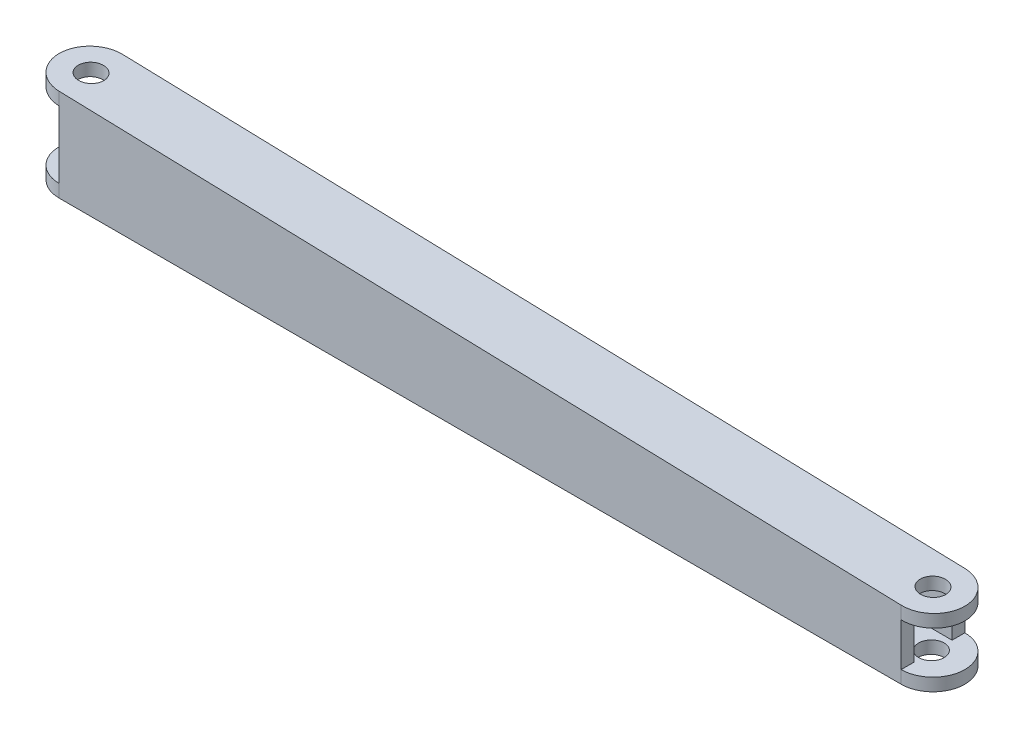
ISO-10303-21;
HEADER;
FILE_DESCRIPTION(('STEP AP214'),'2;1');
FILE_NAME('part.step','',(''),(''),'','','');
FILE_SCHEMA(('AUTOMOTIVE_DESIGN { 1 0 10303 214 1 1 1 1 }'));
ENDSEC;
DATA;
#1=APPLICATION_CONTEXT('core data for automotive mechanical design processes');
#2=APPLICATION_PROTOCOL_DEFINITION('international standard','automotive_design',2000,#1);
#3=PRODUCT_CONTEXT('',#1,'mechanical');
#4=PRODUCT('Part','Part','',(#3));
#5=PRODUCT_RELATED_PRODUCT_CATEGORY('part','',(#4));
#6=PRODUCT_DEFINITION_FORMATION('','',#4);
#7=PRODUCT_DEFINITION_CONTEXT('part definition',#1,'design');
#8=PRODUCT_DEFINITION('design','',#6,#7);
#9=PRODUCT_DEFINITION_SHAPE('','',#8);
#10=(LENGTH_UNIT() NAMED_UNIT(*) SI_UNIT(.MILLI.,.METRE.));
#11=(NAMED_UNIT(*) PLANE_ANGLE_UNIT() SI_UNIT($,.RADIAN.));
#12=(NAMED_UNIT(*) SI_UNIT($,.STERADIAN.) SOLID_ANGLE_UNIT());
#13=UNCERTAINTY_MEASURE_WITH_UNIT(LENGTH_MEASURE(1.E-05),#10,'distance_accuracy_value','');
#14=(GEOMETRIC_REPRESENTATION_CONTEXT(3) GLOBAL_UNCERTAINTY_ASSIGNED_CONTEXT((#13)) GLOBAL_UNIT_ASSIGNED_CONTEXT((#10,
#11,#12)) REPRESENTATION_CONTEXT('',''));
#15=CARTESIAN_POINT('',(0.,0.,0.));
#16=DIRECTION('',(0.,0.,1.));
#17=DIRECTION('',(1.,0.,0.));
#18=AXIS2_PLACEMENT_3D('',#15,#16,#17);
#19=CARTESIAN_POINT('',(-53.9548845265024,0.,5.));
#20=DIRECTION('',(0.,1.,0.));
#21=DIRECTION('',(0.,0.,1.));
#22=AXIS2_PLACEMENT_3D('',#19,#20,#21);
#23=CYLINDRICAL_SURFACE('',#22,5.);
#24=DIRECTION('',(0.,-1.,0.));
#25=VECTOR('',#24,1.);
#26=CARTESIAN_POINT('',(-53.9548845265024,0.,10.));
#27=LINE('',#26,#25);
#28=CARTESIAN_POINT('',(-53.9548845265024,2.,10.));
#29=VERTEX_POINT('',#28);
#30=CARTESIAN_POINT('',(-53.9548845265024,0.,10.));
#31=VERTEX_POINT('',#30);
#32=EDGE_CURVE('E247',#29,#31,#27,.T.);
#33=ORIENTED_EDGE('',*,*,#32,.F.);
#34=CARTESIAN_POINT('',(-53.9548845265024,2.,5.));
#35=DIRECTION('',(0.,1.,0.));
#36=DIRECTION('',(0.,0.,1.));
#37=AXIS2_PLACEMENT_3D('',#34,#35,#36);
#38=CIRCLE('',#37,5.);
#39=CARTESIAN_POINT('',(-53.9548845265024,2.,0.));
#40=VERTEX_POINT('',#39);
#41=EDGE_CURVE('E132',#29,#40,#38,.F.);
#42=ORIENTED_EDGE('',*,*,#41,.T.);
#43=DIRECTION('',(0.,1.,0.));
#44=VECTOR('',#43,1.);
#45=CARTESIAN_POINT('',(-53.9548845265024,0.,0.));
#46=LINE('',#45,#44);
#47=CARTESIAN_POINT('',(-53.9548845265024,0.,0.));
#48=VERTEX_POINT('',#47);
#49=EDGE_CURVE('E244',#48,#40,#46,.T.);
#50=ORIENTED_EDGE('',*,*,#49,.F.);
#51=CARTESIAN_POINT('',(-53.9548845265024,0.,5.));
#52=DIRECTION('',(0.,1.,0.));
#53=DIRECTION('',(0.,0.,1.));
#54=AXIS2_PLACEMENT_3D('',#51,#52,#53);
#55=CIRCLE('',#54,5.);
#56=EDGE_CURVE('E45',#31,#48,#55,.F.);
#57=ORIENTED_EDGE('',*,*,#56,.F.);
#58=EDGE_LOOP('',(#33,#42,#50,#57));
#59=FACE_BOUND('',#58,.T.);
#60=ADVANCED_FACE('F37',(#59),#23,.T.);
#61=CARTESIAN_POINT('',(-53.9548845265024,12.545197785972,0.));
#62=VERTEX_POINT('',#61);
#63=CARTESIAN_POINT('',(-53.9548845265024,14.5460139459733,0.));
#64=VERTEX_POINT('',#63);
#65=EDGE_CURVE('E243',#62,#64,#46,.T.);
#66=ORIENTED_EDGE('',*,*,#65,.F.);
#67=CARTESIAN_POINT('',(-53.9548845265024,12.545197785972,5.));
#68=DIRECTION('',(0.0285597738988771,0.999592086460695,0.));
#69=DIRECTION('',(-0.999592086460695,0.0285597738988771,0.));
#70=AXIS2_PLACEMENT_3D('',#67,#68,#69);
#71=ELLIPSE('',#70,5.00204040000331,5.);
#72=CARTESIAN_POINT('',(-53.9548845265024,12.545197785972,10.));
#73=VERTEX_POINT('',#72);
#74=EDGE_CURVE('E173',#62,#73,#71,.T.);
#75=ORIENTED_EDGE('',*,*,#74,.T.);
#76=CARTESIAN_POINT('',(-53.9548845265024,14.5460139459733,10.));
#77=VERTEX_POINT('',#76);
#78=EDGE_CURVE('E248',#77,#73,#27,.T.);
#79=ORIENTED_EDGE('',*,*,#78,.F.);
#80=CARTESIAN_POINT('',(-53.9548845265024,14.5460139459733,5.));
#81=DIRECTION('',(0.0285597738988771,0.999592086460695,0.));
#82=DIRECTION('',(-0.999592086460695,0.0285597738988771,0.));
#83=AXIS2_PLACEMENT_3D('',#80,#81,#82);
#84=ELLIPSE('',#83,5.00204040000331,5.);
#85=EDGE_CURVE('E11',#64,#77,#84,.T.);
#86=ORIENTED_EDGE('',*,*,#85,.F.);
#87=EDGE_LOOP('',(#66,#75,#79,#86));
#88=FACE_BOUND('',#87,.T.);
#89=ADVANCED_FACE('F293',(#88),#23,.T.);
#90=CARTESIAN_POINT('',(78.323160347252,0.,5.));
#91=DIRECTION('',(0.,1.,0.));
#92=DIRECTION('',(0.,0.,1.));
#93=AXIS2_PLACEMENT_3D('',#90,#91,#92);
#94=CYLINDRICAL_SURFACE('',#93,5.);
#95=DIRECTION('',(0.,-1.,0.));
#96=VECTOR('',#95,1.);
#97=CARTESIAN_POINT('',(78.323160347252,0.,0.));
#98=LINE('',#97,#96);
#99=CARTESIAN_POINT('',(78.323160347252,2.,0.));
#100=VERTEX_POINT('',#99);
#101=CARTESIAN_POINT('',(78.323160347252,0.,0.));
#102=VERTEX_POINT('',#101);
#103=EDGE_CURVE('E233',#100,#102,#98,.T.);
#104=ORIENTED_EDGE('',*,*,#103,.F.);
#105=CARTESIAN_POINT('',(78.323160347252,2.,5.));
#106=DIRECTION('',(0.,1.,0.));
#107=DIRECTION('',(0.,0.,1.));
#108=AXIS2_PLACEMENT_3D('',#105,#106,#107);
#109=CIRCLE('',#108,5.);
#110=CARTESIAN_POINT('',(78.323160347252,2.,10.));
#111=VERTEX_POINT('',#110);
#112=EDGE_CURVE('E195',#100,#111,#109,.F.);
#113=ORIENTED_EDGE('',*,*,#112,.T.);
#114=DIRECTION('',(0.,1.,0.));
#115=VECTOR('',#114,1.);
#116=CARTESIAN_POINT('',(78.323160347252,0.,10.));
#117=LINE('',#116,#115);
#118=CARTESIAN_POINT('',(78.323160347252,0.,10.));
#119=VERTEX_POINT('',#118);
#120=EDGE_CURVE('E230',#119,#111,#117,.T.);
#121=ORIENTED_EDGE('',*,*,#120,.F.);
#122=CARTESIAN_POINT('',(78.323160347252,0.,5.));
#123=DIRECTION('',(0.,1.,0.));
#124=DIRECTION('',(0.,0.,1.));
#125=AXIS2_PLACEMENT_3D('',#122,#123,#124);
#126=CIRCLE('',#125,5.);
#127=EDGE_CURVE('E237',#102,#119,#126,.F.);
#128=ORIENTED_EDGE('',*,*,#127,.F.);
#129=EDGE_LOOP('',(#104,#113,#121,#128));
#130=FACE_BOUND('',#129,.T.);
#131=ADVANCED_FACE('F264',(#130),#94,.T.);
#132=CARTESIAN_POINT('',(78.323160347252,8.7658250752933,10.));
#133=VERTEX_POINT('',#132);
#134=CARTESIAN_POINT('',(78.323160347252,10.7666412352946,10.));
#135=VERTEX_POINT('',#134);
#136=EDGE_CURVE('E226',#133,#135,#117,.T.);
#137=ORIENTED_EDGE('',*,*,#136,.F.);
#138=CARTESIAN_POINT('',(78.323160347252,8.7658250752933,5.));
#139=DIRECTION('',(0.0285597738988771,0.999592086460695,0.));
#140=DIRECTION('',(-0.999592086460695,0.0285597738988771,0.));
#141=AXIS2_PLACEMENT_3D('',#138,#139,#140);
#142=ELLIPSE('',#141,5.00204040000331,5.);
#143=CARTESIAN_POINT('',(78.323160347252,8.7658250752933,0.));
#144=VERTEX_POINT('',#143);
#145=EDGE_CURVE('E191',#133,#144,#142,.T.);
#146=ORIENTED_EDGE('',*,*,#145,.T.);
#147=CARTESIAN_POINT('',(78.323160347252,10.7666412352946,0.));
#148=VERTEX_POINT('',#147);
#149=EDGE_CURVE('E234',#148,#144,#98,.T.);
#150=ORIENTED_EDGE('',*,*,#149,.F.);
#151=CARTESIAN_POINT('',(78.323160347252,10.7666412352946,5.));
#152=DIRECTION('',(0.0285597738988771,0.999592086460695,0.));
#153=DIRECTION('',(-0.999592086460695,0.0285597738988771,0.));
#154=AXIS2_PLACEMENT_3D('',#151,#152,#153);
#155=ELLIPSE('',#154,5.00204040000331,5.);
#156=EDGE_CURVE('E240',#135,#148,#155,.T.);
#157=ORIENTED_EDGE('',*,*,#156,.F.);
#158=EDGE_LOOP('',(#137,#146,#150,#157));
#159=FACE_BOUND('',#158,.T.);
#160=ADVANCED_FACE('F287',(#159),#94,.T.);
#161=CARTESIAN_POINT('',(77.7519648692744,-9.22520049391926,5.));
#162=DIRECTION('',(0.0285597738988771,0.999592086460695,0.));
#163=DIRECTION('',(-0.999592086460695,0.0285597738988771,0.));
#164=AXIS2_PLACEMENT_3D('',#161,#162,#163);
#165=CYLINDRICAL_SURFACE('',#164,2.);
#166=CARTESIAN_POINT('',(78.323160347252,10.7666412352946,5.));
#167=DIRECTION('',(0.0285597738988771,0.999592086460695,0.));
#168=DIRECTION('',(-0.999592086460695,0.0285597738988771,0.));
#169=AXIS2_PLACEMENT_3D('',#166,#167,#168);
#170=CIRCLE('',#169,2.);
#171=CARTESIAN_POINT('',(76.3239761743306,10.8237607830924,5.));
#172=VERTEX_POINT('',#171);
#173=EDGE_CURVE('E185',#172,#172,#170,.T.);
#174=ORIENTED_EDGE('',*,*,#173,.T.);
#175=EDGE_LOOP('',(#174));
#176=FACE_BOUND('',#175,.T.);
#177=CARTESIAN_POINT('',(78.2660407994542,8.76745706237324,5.));
#178=DIRECTION('',(0.0285597738988771,0.999592086460695,0.));
#179=DIRECTION('',(-0.999592086460695,0.0285597738988771,0.));
#180=AXIS2_PLACEMENT_3D('',#177,#178,#179);
#181=CIRCLE('',#180,2.);
#182=CARTESIAN_POINT('',(76.2668566265328,8.824576610171,5.));
#183=VERTEX_POINT('',#182);
#184=EDGE_CURVE('E203',#183,#183,#181,.T.);
#185=ORIENTED_EDGE('',*,*,#184,.F.);
#186=EDGE_LOOP('',(#185));
#187=FACE_BOUND('',#186,.T.);
#188=ADVANCED_FACE('F316',(#176,#187),#165,.F.);
#189=CARTESIAN_POINT('',(-54.5260800044799,-5.44582778324056,5.));
#190=DIRECTION('',(0.0285597738988771,0.999592086460695,0.));
#191=DIRECTION('',(-0.999592086460695,0.0285597738988771,0.));
#192=AXIS2_PLACEMENT_3D('',#189,#190,#191);
#193=CYLINDRICAL_SURFACE('',#192,2.);
#194=CARTESIAN_POINT('',(-53.9548845265024,14.5460139459733,5.));
#195=DIRECTION('',(0.0285597738988771,0.999592086460695,0.));
#196=DIRECTION('',(-0.999592086460695,0.0285597738988771,0.));
#197=AXIS2_PLACEMENT_3D('',#194,#195,#196);
#198=CIRCLE('',#197,2.);
#199=CARTESIAN_POINT('',(-55.9540686994238,14.6031334937711,5.));
#200=VERTEX_POINT('',#199);
#201=EDGE_CURVE('E208',#200,#200,#198,.T.);
#202=ORIENTED_EDGE('',*,*,#201,.T.);
#203=EDGE_LOOP('',(#202));
#204=FACE_BOUND('',#203,.T.);
#205=CARTESIAN_POINT('',(-54.0120040743001,12.5468297730519,5.));
#206=DIRECTION('',(0.0285597738988771,0.999592086460695,0.));
#207=DIRECTION('',(-0.999592086460695,0.0285597738988771,0.));
#208=AXIS2_PLACEMENT_3D('',#205,#206,#207);
#209=CIRCLE('',#208,2.);
#210=CARTESIAN_POINT('',(-56.0111882472215,12.6039493208497,5.));
#211=VERTEX_POINT('',#210);
#212=EDGE_CURVE('E169',#211,#211,#209,.T.);
#213=ORIENTED_EDGE('',*,*,#212,.F.);
#214=EDGE_LOOP('',(#213));
#215=FACE_BOUND('',#214,.T.);
#216=ADVANCED_FACE('F326',(#204,#215),#193,.F.);
#217=CARTESIAN_POINT('',(-58.9548845265024,0.,10.));
#218=DIRECTION('',(0.,1.,0.));
#219=DIRECTION('',(0.,0.,1.));
#220=AXIS2_PLACEMENT_3D('',#217,#218,#219);
#221=PLANE('',#220);
#222=CARTESIAN_POINT('',(-54.3704849249588,0.,5.));
#223=DIRECTION('',(0.,1.,0.));
#224=DIRECTION('',(1.,0.,0.));
#225=AXIS2_PLACEMENT_3D('',#222,#223,#224);
#226=ELLIPSE('',#225,2.00081616000133,2.);
#227=CARTESIAN_POINT('',(-52.3696687649574,0.,5.));
#228=VERTEX_POINT('',#227);
#229=EDGE_CURVE('E216',#228,#228,#226,.T.);
#230=ORIENTED_EDGE('',*,*,#229,.T.);
#231=EDGE_LOOP('',(#230));
#232=FACE_BOUND('',#231,.T.);
#233=CARTESIAN_POINT('',(78.0155420262436,0.,5.));
#234=DIRECTION('',(0.,1.,0.));
#235=DIRECTION('',(1.,0.,0.));
#236=AXIS2_PLACEMENT_3D('',#233,#234,#235);
#237=ELLIPSE('',#236,2.00081616000132,2.);
#238=CARTESIAN_POINT('',(80.0163581862449,0.,5.));
#239=VERTEX_POINT('',#238);
#240=EDGE_CURVE('E211',#239,#239,#237,.T.);
#241=ORIENTED_EDGE('',*,*,#240,.T.);
#242=EDGE_LOOP('',(#241));
#243=FACE_BOUND('',#242,.T.);
#244=DIRECTION('',(1.,0.,0.));
#245=VECTOR('',#244,1.);
#246=CARTESIAN_POINT('',(-58.9548845265024,0.,10.));
#247=LINE('',#246,#245);
#248=EDGE_CURVE('E223',#31,#119,#247,.T.);
#249=ORIENTED_EDGE('',*,*,#248,.F.);
#250=ORIENTED_EDGE('',*,*,#56,.T.);
#251=DIRECTION('',(1.,0.,0.));
#252=VECTOR('',#251,1.);
#253=CARTESIAN_POINT('',(-58.9548845265024,0.,0.));
#254=LINE('',#253,#252);
#255=EDGE_CURVE('E224',#48,#102,#254,.T.);
#256=ORIENTED_EDGE('',*,*,#255,.T.);
#257=ORIENTED_EDGE('',*,*,#127,.T.);
#258=EDGE_LOOP('',(#249,#250,#256,#257));
#259=FACE_BOUND('',#258,.T.);
#260=ADVANCED_FACE('F254',(#232,#243,#259),#221,.F.);
#261=CARTESIAN_POINT('',(-58.9548845265024,14.6888710888305,10.));
#262=DIRECTION('',(0.0285597738988771,0.999592086460695,0.));
#263=DIRECTION('',(-0.999592086460695,0.0285597738988771,0.));
#264=AXIS2_PLACEMENT_3D('',#261,#262,#263);
#265=PLANE('',#264);
#266=ORIENTED_EDGE('',*,*,#201,.F.);
#267=EDGE_LOOP('',(#266));
#268=FACE_BOUND('',#267,.T.);
#269=ORIENTED_EDGE('',*,*,#173,.F.);
#270=EDGE_LOOP('',(#269));
#271=FACE_BOUND('',#270,.T.);
#272=DIRECTION('',(0.999592086460695,-0.0285597738988771,0.));
#273=VECTOR('',#272,1.);
#274=CARTESIAN_POINT('',(-58.9548845265024,14.6888710888305,0.));
#275=LINE('',#274,#273);
#276=EDGE_CURVE('E219',#64,#148,#275,.T.);
#277=ORIENTED_EDGE('',*,*,#276,.F.);
#278=ORIENTED_EDGE('',*,*,#85,.T.);
#279=DIRECTION('',(0.999592086460695,-0.0285597738988771,0.));
#280=VECTOR('',#279,1.);
#281=CARTESIAN_POINT('',(-58.9548845265024,14.6888710888305,10.));
#282=LINE('',#281,#280);
#283=EDGE_CURVE('E220',#77,#135,#282,.T.);
#284=ORIENTED_EDGE('',*,*,#283,.T.);
#285=ORIENTED_EDGE('',*,*,#156,.T.);
#286=EDGE_LOOP('',(#277,#278,#284,#285));
#287=FACE_BOUND('',#286,.T.);
#288=ADVANCED_FACE('F291',(#268,#271,#287),#265,.T.);
#289=CARTESIAN_POINT('',(0.,0.,10.));
#290=DIRECTION('',(0.,0.,-1.));
#291=DIRECTION('',(-1.,0.,0.));
#292=AXIS2_PLACEMENT_3D('',#289,#290,#291);
#293=PLANE('',#292);
#294=ORIENTED_EDGE('',*,*,#283,.F.);
#295=ORIENTED_EDGE('',*,*,#78,.T.);
#296=DIRECTION('',(0.,-1.,0.));
#297=VECTOR('',#296,1.);
#298=CARTESIAN_POINT('',(-53.9548845265024,0.,10.));
#299=LINE('',#298,#297);
#300=EDGE_CURVE('E158',#73,#29,#299,.T.);
#301=ORIENTED_EDGE('',*,*,#300,.T.);
#302=ORIENTED_EDGE('',*,*,#32,.T.);
#303=ORIENTED_EDGE('',*,*,#248,.T.);
#304=ORIENTED_EDGE('',*,*,#120,.T.);
#305=DIRECTION('',(0.,1.,0.));
#306=VECTOR('',#305,1.);
#307=CARTESIAN_POINT('',(78.323160347252,0.,10.));
#308=LINE('',#307,#306);
#309=EDGE_CURVE('E148',#111,#133,#308,.T.);
#310=ORIENTED_EDGE('',*,*,#309,.T.);
#311=ORIENTED_EDGE('',*,*,#136,.T.);
#312=EDGE_LOOP('',(#294,#295,#301,#302,#303,#304,#310,#311));
#313=FACE_BOUND('',#312,.T.);
#314=ADVANCED_FACE('F268',(#313),#293,.F.);
#315=CARTESIAN_POINT('',(0.,0.,0.));
#316=DIRECTION('',(0.,0.,-1.));
#317=DIRECTION('',(-1.,0.,0.));
#318=AXIS2_PLACEMENT_3D('',#315,#316,#317);
#319=PLANE('',#318);
#320=ORIENTED_EDGE('',*,*,#255,.F.);
#321=ORIENTED_EDGE('',*,*,#49,.T.);
#322=DIRECTION('',(0.,1.,0.));
#323=VECTOR('',#322,1.);
#324=CARTESIAN_POINT('',(-53.9548845265024,0.,0.));
#325=LINE('',#324,#323);
#326=EDGE_CURVE('E194',#40,#62,#325,.T.);
#327=ORIENTED_EDGE('',*,*,#326,.T.);
#328=ORIENTED_EDGE('',*,*,#65,.T.);
#329=ORIENTED_EDGE('',*,*,#276,.T.);
#330=ORIENTED_EDGE('',*,*,#149,.T.);
#331=DIRECTION('',(0.,-1.,0.));
#332=VECTOR('',#331,1.);
#333=CARTESIAN_POINT('',(78.323160347252,0.,0.));
#334=LINE('',#333,#332);
#335=EDGE_CURVE('E152',#144,#100,#334,.T.);
#336=ORIENTED_EDGE('',*,*,#335,.T.);
#337=ORIENTED_EDGE('',*,*,#103,.T.);
#338=EDGE_LOOP('',(#320,#321,#327,#328,#329,#330,#336,#337));
#339=FACE_BOUND('',#338,.T.);
#340=ADVANCED_FACE('F260',(#339),#319,.T.);
#341=CARTESIAN_POINT('',(78.0726848833864,2.,5.));
#342=DIRECTION('',(0.,1.,0.));
#343=DIRECTION('',(1.,0.,0.));
#344=AXIS2_PLACEMENT_3D('',#341,#342,#343);
#345=ELLIPSE('',#344,2.00081616000132,2.);
#346=CARTESIAN_POINT('',(80.0735010433877,2.,5.));
#347=VERTEX_POINT('',#346);
#348=EDGE_CURVE('E167',#347,#347,#345,.T.);
#349=ORIENTED_EDGE('',*,*,#348,.T.);
#350=EDGE_LOOP('',(#349));
#351=FACE_BOUND('',#350,.T.);
#352=ORIENTED_EDGE('',*,*,#240,.F.);
#353=EDGE_LOOP('',(#352));
#354=FACE_BOUND('',#353,.T.);
#355=ADVANCED_FACE('F330',(#351,#354),#165,.F.);
#356=CARTESIAN_POINT('',(-54.3133420678159,2.,5.));
#357=DIRECTION('',(0.,1.,0.));
#358=DIRECTION('',(1.,0.,0.));
#359=AXIS2_PLACEMENT_3D('',#356,#357,#358);
#360=ELLIPSE('',#359,2.00081616000133,2.);
#361=CARTESIAN_POINT('',(-52.3125259078146,2.,5.));
#362=VERTEX_POINT('',#361);
#363=EDGE_CURVE('E164',#362,#362,#360,.T.);
#364=ORIENTED_EDGE('',*,*,#363,.T.);
#365=EDGE_LOOP('',(#364));
#366=FACE_BOUND('',#365,.T.);
#367=ORIENTED_EDGE('',*,*,#229,.F.);
#368=EDGE_LOOP('',(#367));
#369=FACE_BOUND('',#368,.T.);
#370=ADVANCED_FACE('F335',(#366,#369),#193,.F.);
#371=CARTESIAN_POINT('',(78.323160347252,5.38332061764731,0.));
#372=DIRECTION('',(1.,0.,0.));
#373=DIRECTION('',(0.,-1.,0.));
#374=AXIS2_PLACEMENT_3D('',#371,#372,#373);
#375=PLANE('',#374);
#376=ORIENTED_EDGE('',*,*,#335,.F.);
#377=DIRECTION('',(0.,0.,1.));
#378=VECTOR('',#377,1.);
#379=CARTESIAN_POINT('',(78.323160347252,8.7658250752933,0.));
#380=LINE('',#379,#378);
#381=CARTESIAN_POINT('',(78.323160347252,8.7658250752933,2.));
#382=VERTEX_POINT('',#381);
#383=EDGE_CURVE('E59',#382,#144,#380,.F.);
#384=ORIENTED_EDGE('',*,*,#383,.F.);
#385=DIRECTION('',(0.,1.,0.));
#386=VECTOR('',#385,1.);
#387=CARTESIAN_POINT('',(78.323160347252,5.38332061764731,2.));
#388=LINE('',#387,#386);
#389=CARTESIAN_POINT('',(78.323160347252,2.,2.));
#390=VERTEX_POINT('',#389);
#391=EDGE_CURVE('E186',#382,#390,#388,.F.);
#392=ORIENTED_EDGE('',*,*,#391,.T.);
#393=DIRECTION('',(0.,0.,1.));
#394=VECTOR('',#393,1.);
#395=CARTESIAN_POINT('',(78.323160347252,2.,0.));
#396=LINE('',#395,#394);
#397=EDGE_CURVE('E182',#390,#100,#396,.F.);
#398=ORIENTED_EDGE('',*,*,#397,.T.);
#399=EDGE_LOOP('',(#376,#384,#392,#398));
#400=FACE_BOUND('',#399,.T.);
#401=ADVANCED_FACE('F283',(#400),#375,.T.);
#402=CARTESIAN_POINT('',(78.323160347252,5.38332061764731,10.));
#403=DIRECTION('',(1.,0.,0.));
#404=DIRECTION('',(0.,1.,0.));
#405=AXIS2_PLACEMENT_3D('',#402,#403,#404);
#406=PLANE('',#405);
#407=ORIENTED_EDGE('',*,*,#309,.F.);
#408=DIRECTION('',(0.,0.,1.));
#409=VECTOR('',#408,1.);
#410=CARTESIAN_POINT('',(78.323160347252,2.,10.));
#411=LINE('',#410,#409);
#412=CARTESIAN_POINT('',(78.323160347252,2.,8.));
#413=VERTEX_POINT('',#412);
#414=EDGE_CURVE('E135',#413,#111,#411,.T.);
#415=ORIENTED_EDGE('',*,*,#414,.F.);
#416=DIRECTION('',(0.,-1.,0.));
#417=VECTOR('',#416,1.);
#418=CARTESIAN_POINT('',(78.323160347252,0.,8.));
#419=LINE('',#418,#417);
#420=CARTESIAN_POINT('',(78.323160347252,8.7658250752933,8.));
#421=VERTEX_POINT('',#420);
#422=EDGE_CURVE('E142',#413,#421,#419,.F.);
#423=ORIENTED_EDGE('',*,*,#422,.T.);
#424=DIRECTION('',(0.,0.,-1.));
#425=VECTOR('',#424,1.);
#426=CARTESIAN_POINT('',(78.323160347252,8.7658250752933,10.));
#427=LINE('',#426,#425);
#428=EDGE_CURVE('E190',#421,#133,#427,.F.);
#429=ORIENTED_EDGE('',*,*,#428,.T.);
#430=EDGE_LOOP('',(#407,#415,#423,#429));
#431=FACE_BOUND('',#430,.T.);
#432=ADVANCED_FACE('F375',(#431),#406,.T.);
#433=CARTESIAN_POINT('',(-53.9548845265024,7.27300697298667,10.));
#434=DIRECTION('',(-1.,0.,0.));
#435=DIRECTION('',(0.,-1.,0.));
#436=AXIS2_PLACEMENT_3D('',#433,#434,#435);
#437=PLANE('',#436);
#438=ORIENTED_EDGE('',*,*,#300,.F.);
#439=DIRECTION('',(0.,0.,-1.));
#440=VECTOR('',#439,1.);
#441=CARTESIAN_POINT('',(-53.9548845265024,12.545197785972,10.));
#442=LINE('',#441,#440);
#443=CARTESIAN_POINT('',(-53.9548845265024,12.545197785972,8.));
#444=VERTEX_POINT('',#443);
#445=EDGE_CURVE('E52',#444,#73,#442,.F.);
#446=ORIENTED_EDGE('',*,*,#445,.F.);
#447=DIRECTION('',(0.,1.,0.));
#448=VECTOR('',#447,1.);
#449=CARTESIAN_POINT('',(-53.9548845265024,0.,8.));
#450=LINE('',#449,#448);
#451=CARTESIAN_POINT('',(-53.9548845265024,2.,8.));
#452=VERTEX_POINT('',#451);
#453=EDGE_CURVE('E138',#444,#452,#450,.F.);
#454=ORIENTED_EDGE('',*,*,#453,.T.);
#455=DIRECTION('',(0.,0.,-1.));
#456=VECTOR('',#455,1.);
#457=CARTESIAN_POINT('',(-53.9548845265024,2.,10.));
#458=LINE('',#457,#456);
#459=EDGE_CURVE('E124',#452,#29,#458,.F.);
#460=ORIENTED_EDGE('',*,*,#459,.T.);
#461=EDGE_LOOP('',(#438,#446,#454,#460));
#462=FACE_BOUND('',#461,.T.);
#463=ADVANCED_FACE('F139',(#462),#437,.T.);
#464=CARTESIAN_POINT('',(-53.9548845265024,7.27300697298667,0.));
#465=DIRECTION('',(-1.,0.,0.));
#466=DIRECTION('',(0.,1.,0.));
#467=AXIS2_PLACEMENT_3D('',#464,#465,#466);
#468=PLANE('',#467);
#469=ORIENTED_EDGE('',*,*,#326,.F.);
#470=DIRECTION('',(0.,0.,-1.));
#471=VECTOR('',#470,1.);
#472=CARTESIAN_POINT('',(-53.9548845265024,2.,0.));
#473=LINE('',#472,#471);
#474=CARTESIAN_POINT('',(-53.9548845265024,2.,2.));
#475=VERTEX_POINT('',#474);
#476=EDGE_CURVE('E178',#475,#40,#473,.T.);
#477=ORIENTED_EDGE('',*,*,#476,.F.);
#478=DIRECTION('',(0.,-1.,0.));
#479=VECTOR('',#478,1.);
#480=CARTESIAN_POINT('',(-53.9548845265024,7.27300697298667,2.));
#481=LINE('',#480,#479);
#482=CARTESIAN_POINT('',(-53.9548845265024,12.545197785972,2.));
#483=VERTEX_POINT('',#482);
#484=EDGE_CURVE('E143',#475,#483,#481,.F.);
#485=ORIENTED_EDGE('',*,*,#484,.T.);
#486=DIRECTION('',(0.,0.,1.));
#487=VECTOR('',#486,1.);
#488=CARTESIAN_POINT('',(-53.9548845265024,12.545197785972,10.));
#489=LINE('',#488,#487);
#490=EDGE_CURVE('E172',#483,#62,#489,.F.);
#491=ORIENTED_EDGE('',*,*,#490,.T.);
#492=EDGE_LOOP('',(#469,#477,#485,#491));
#493=FACE_BOUND('',#492,.T.);
#494=ADVANCED_FACE('F275',(#493),#468,.T.);
#495=CARTESIAN_POINT('',(-58.9548845265024,2.,10.));
#496=DIRECTION('',(0.,1.,0.));
#497=DIRECTION('',(0.,0.,1.));
#498=AXIS2_PLACEMENT_3D('',#495,#496,#497);
#499=PLANE('',#498);
#500=ORIENTED_EDGE('',*,*,#363,.F.);
#501=EDGE_LOOP('',(#500));
#502=FACE_BOUND('',#501,.T.);
#503=ORIENTED_EDGE('',*,*,#348,.F.);
#504=EDGE_LOOP('',(#503));
#505=FACE_BOUND('',#504,.T.);
#506=DIRECTION('',(1.,0.,0.));
#507=VECTOR('',#506,1.);
#508=CARTESIAN_POINT('',(0.,2.,8.));
#509=LINE('',#508,#507);
#510=EDGE_CURVE('E129',#452,#413,#509,.T.);
#511=ORIENTED_EDGE('',*,*,#510,.T.);
#512=ORIENTED_EDGE('',*,*,#414,.T.);
#513=ORIENTED_EDGE('',*,*,#112,.F.);
#514=ORIENTED_EDGE('',*,*,#397,.F.);
#515=DIRECTION('',(1.,0.,0.));
#516=VECTOR('',#515,1.);
#517=CARTESIAN_POINT('',(0.,2.,2.));
#518=LINE('',#517,#516);
#519=EDGE_CURVE('E154',#475,#390,#518,.T.);
#520=ORIENTED_EDGE('',*,*,#519,.F.);
#521=ORIENTED_EDGE('',*,*,#476,.T.);
#522=ORIENTED_EDGE('',*,*,#41,.F.);
#523=ORIENTED_EDGE('',*,*,#459,.F.);
#524=EDGE_LOOP('',(#511,#512,#513,#514,#520,#521,#522,#523));
#525=FACE_BOUND('',#524,.T.);
#526=ADVANCED_FACE('F126',(#502,#505,#525),#499,.T.);
#527=CARTESIAN_POINT('',(-59.0120040743001,12.6896869159091,10.));
#528=DIRECTION('',(0.0285597738988771,0.999592086460695,0.));
#529=DIRECTION('',(-0.999592086460695,0.0285597738988771,0.));
#530=AXIS2_PLACEMENT_3D('',#527,#528,#529);
#531=PLANE('',#530);
#532=ORIENTED_EDGE('',*,*,#212,.T.);
#533=EDGE_LOOP('',(#532));
#534=FACE_BOUND('',#533,.T.);
#535=ORIENTED_EDGE('',*,*,#184,.T.);
#536=EDGE_LOOP('',(#535));
#537=FACE_BOUND('',#536,.T.);
#538=DIRECTION('',(0.999592086460695,-0.0285597738988771,0.));
#539=VECTOR('',#538,1.);
#540=CARTESIAN_POINT('',(0.314132983672528,10.9946544285384,2.));
#541=LINE('',#540,#539);
#542=EDGE_CURVE('E161',#483,#382,#541,.T.);
#543=ORIENTED_EDGE('',*,*,#542,.T.);
#544=ORIENTED_EDGE('',*,*,#383,.T.);
#545=ORIENTED_EDGE('',*,*,#145,.F.);
#546=ORIENTED_EDGE('',*,*,#428,.F.);
#547=DIRECTION('',(0.999592086460695,-0.0285597738988771,0.));
#548=VECTOR('',#547,1.);
#549=CARTESIAN_POINT('',(0.314132983672528,10.9946544285384,8.));
#550=LINE('',#549,#548);
#551=EDGE_CURVE('E149',#444,#421,#550,.T.);
#552=ORIENTED_EDGE('',*,*,#551,.F.);
#553=ORIENTED_EDGE('',*,*,#445,.T.);
#554=ORIENTED_EDGE('',*,*,#74,.F.);
#555=ORIENTED_EDGE('',*,*,#490,.F.);
#556=EDGE_LOOP('',(#543,#544,#545,#546,#552,#553,#554,#555));
#557=FACE_BOUND('',#556,.T.);
#558=ADVANCED_FACE('F294',(#534,#537,#557),#531,.F.);
#559=CARTESIAN_POINT('',(0.,0.,8.));
#560=DIRECTION('',(0.,0.,-1.));
#561=DIRECTION('',(-1.,0.,0.));
#562=AXIS2_PLACEMENT_3D('',#559,#560,#561);
#563=PLANE('',#562);
#564=ORIENTED_EDGE('',*,*,#551,.T.);
#565=ORIENTED_EDGE('',*,*,#422,.F.);
#566=ORIENTED_EDGE('',*,*,#510,.F.);
#567=ORIENTED_EDGE('',*,*,#453,.F.);
#568=EDGE_LOOP('',(#564,#565,#566,#567));
#569=FACE_BOUND('',#568,.T.);
#570=ADVANCED_FACE('F146',(#569),#563,.T.);
#571=CARTESIAN_POINT('',(0.,0.,2.));
#572=DIRECTION('',(0.,0.,-1.));
#573=DIRECTION('',(-1.,0.,0.));
#574=AXIS2_PLACEMENT_3D('',#571,#572,#573);
#575=PLANE('',#574);
#576=ORIENTED_EDGE('',*,*,#519,.T.);
#577=ORIENTED_EDGE('',*,*,#391,.F.);
#578=ORIENTED_EDGE('',*,*,#542,.F.);
#579=ORIENTED_EDGE('',*,*,#484,.F.);
#580=EDGE_LOOP('',(#576,#577,#578,#579));
#581=FACE_BOUND('',#580,.T.);
#582=ADVANCED_FACE('F280',(#581),#575,.F.);
#583=CLOSED_SHELL('',(#60,#89,#131,#160,#188,#216,#260,#288,#314,#340,#355,#370,#401,#432,#463,
#494,#526,#558,#570,#582));
#584=MANIFOLD_SOLID_BREP('B2',#583);
#585=ADVANCED_BREP_SHAPE_REPRESENTATION('',(#18,#584),#14);
#586=SHAPE_DEFINITION_REPRESENTATION(#9,#585);
ENDSEC;
END-ISO-10303-21;
